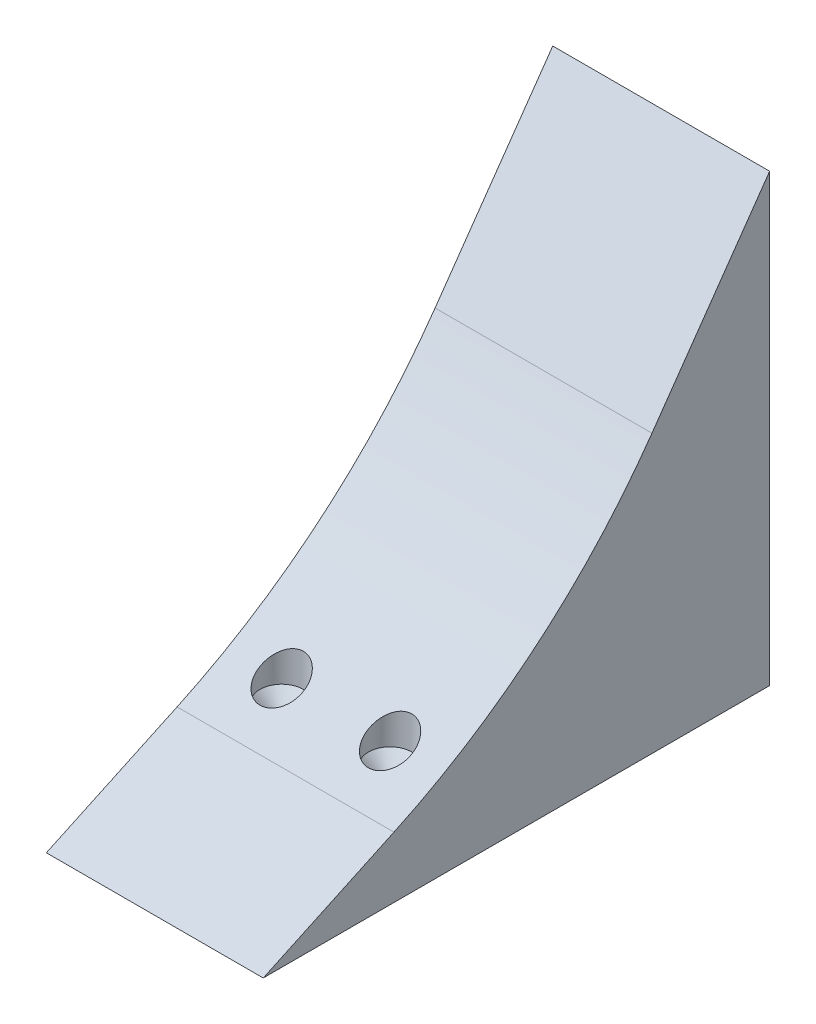
ISO-10303-21;
HEADER;
FILE_DESCRIPTION(('STEP AP214'),'2;1');
FILE_NAME('part.step','',(''),(''),'','','');
FILE_SCHEMA(('AUTOMOTIVE_DESIGN { 1 0 10303 214 1 1 1 1 }'));
ENDSEC;
DATA;
#1=APPLICATION_CONTEXT('core data for automotive mechanical design processes');
#2=APPLICATION_PROTOCOL_DEFINITION('international standard','automotive_design',2000,#1);
#3=PRODUCT_CONTEXT('',#1,'mechanical');
#4=PRODUCT('Part','Part','',(#3));
#5=PRODUCT_RELATED_PRODUCT_CATEGORY('part','',(#4));
#6=PRODUCT_DEFINITION_FORMATION('','',#4);
#7=PRODUCT_DEFINITION_CONTEXT('part definition',#1,'design');
#8=PRODUCT_DEFINITION('design','',#6,#7);
#9=PRODUCT_DEFINITION_SHAPE('','',#8);
#10=(LENGTH_UNIT() NAMED_UNIT(*) SI_UNIT(.MILLI.,.METRE.));
#11=(NAMED_UNIT(*) PLANE_ANGLE_UNIT() SI_UNIT($,.RADIAN.));
#12=(NAMED_UNIT(*) SI_UNIT($,.STERADIAN.) SOLID_ANGLE_UNIT());
#13=UNCERTAINTY_MEASURE_WITH_UNIT(LENGTH_MEASURE(1.E-05),#10,'distance_accuracy_value','');
#14=(GEOMETRIC_REPRESENTATION_CONTEXT(3) GLOBAL_UNCERTAINTY_ASSIGNED_CONTEXT((#13)) GLOBAL_UNIT_ASSIGNED_CONTEXT((#10,
#11,#12)) REPRESENTATION_CONTEXT('',''));
#15=CARTESIAN_POINT('',(0.,0.,0.));
#16=DIRECTION('',(0.,0.,1.));
#17=DIRECTION('',(1.,0.,0.));
#18=AXIS2_PLACEMENT_3D('',#15,#16,#17);
#19=CARTESIAN_POINT('',(50.8,28.0847994332052,95.2759098807705));
#20=DIRECTION('',(-1.,0.,0.));
#21=DIRECTION('',(0.,0.,1.));
#22=AXIS2_PLACEMENT_3D('',#19,#20,#21);
#23=CYLINDRICAL_SURFACE('',#22,152.4);
#24=CARTESIAN_POINT('',(12.7,-100.831148377762,13.9959098807705));
#25=CARTESIAN_POINT('',(12.827095889129,-100.831146925053,13.9959077338625));
#26=CARTESIAN_POINT('',(12.954168337019,-100.834158644722,14.0006838358532));
#27=CARTESIAN_POINT('',(13.2073590694925,-100.846155104622,14.0197156893053));
#28=CARTESIAN_POINT('',(13.3334771112958,-100.855141316184,14.0339737758832));
#29=CARTESIAN_POINT('',(13.583836827044,-100.878956948277,14.0717841490509));
#30=CARTESIAN_POINT('',(13.7080771234869,-100.893790461031,14.0953429447426));
#31=CARTESIAN_POINT('',(13.9537452936141,-100.929081379971,14.1514397468149));
#32=CARTESIAN_POINT('',(14.0751720152792,-100.94954104716,14.183981363177));
#33=CARTESIAN_POINT('',(14.3138567866955,-100.995694177725,14.25746728632));
#34=CARTESIAN_POINT('',(14.431130177653,-101.021365341579,14.2983757973141));
#35=CARTESIAN_POINT('',(14.6613661964323,-101.077653533963,14.3881879959891));
#36=CARTESIAN_POINT('',(14.7743271719837,-101.108272435132,14.4370947109454));
#37=CARTESIAN_POINT('',(15.1057171021053,-101.206978793559,14.5949859622279));
#38=CARTESIAN_POINT('',(15.3168808773068,-101.281960831124,14.7152129265991));
#39=CARTESIAN_POINT('',(15.7280461076282,-101.452118847568,14.9890848863961));
#40=CARTESIAN_POINT('',(15.9265732442734,-101.548249939235,15.14432490556));
#41=CARTESIAN_POINT('',(16.2949794432509,-101.753968029832,15.478084589699));
#42=CARTESIAN_POINT('',(16.4648463452128,-101.863560706527,15.6566140795798));
#43=CARTESIAN_POINT('',(16.7972552974629,-102.109801400589,16.0598164901569));
#44=CARTESIAN_POINT('',(16.9550534750942,-102.248058683302,16.287415042392));
#45=CARTESIAN_POINT('',(17.2300247530824,-102.533711225513,16.7606805266267));
#46=CARTESIAN_POINT('',(17.3471738840227,-102.681111816346,17.0063580160561));
#47=CARTESIAN_POINT('',(17.553604500292,-103.002199985407,17.545158059831));
#48=CARTESIAN_POINT('',(17.6367895530178,-103.17670334522,17.8401426625707));
#49=CARTESIAN_POINT('',(17.7491095191719,-103.52807821422,18.4388664160298));
#50=CARTESIAN_POINT('',(17.7782182043303,-103.704950830685,18.7426097424388));
#51=CARTESIAN_POINT('',(17.7817500527579,-104.070335474302,19.3751645021489));
#52=CARTESIAN_POINT('',(17.7518190194479,-104.25870270854,19.7041159179249));
#53=CARTESIAN_POINT('',(17.6587965782812,-104.535346963207,20.1913434883379));
#54=CARTESIAN_POINT('',(17.6197252867779,-104.626637140789,20.3528267474144));
#55=CARTESIAN_POINT('',(17.5254602980328,-104.806594348569,20.6724853068499));
#56=CARTESIAN_POINT('',(17.4702744096019,-104.895262626422,20.8306621697331));
#57=CARTESIAN_POINT('',(17.3449888107755,-105.067586834879,21.139328429104));
#58=CARTESIAN_POINT('',(17.2751965952473,-105.15130639171,21.289907190589));
#59=CARTESIAN_POINT('',(17.1202071069377,-105.314788478739,21.5850801784497));
#60=CARTESIAN_POINT('',(17.035017451534,-105.394552940836,21.729677320761));
#61=CARTESIAN_POINT('',(16.8494269040788,-105.549393350824,22.0114003504996));
#62=CARTESIAN_POINT('',(16.749029104856,-105.624470247636,22.1485277493315));
#63=CARTESIAN_POINT('',(16.5333784312333,-105.769151867417,22.4136938278648));
#64=CARTESIAN_POINT('',(16.4181277316201,-105.838757389117,22.5417338339095));
#65=CARTESIAN_POINT('',(16.1861977308859,-105.96470071235,22.7741366949434));
#66=CARTESIAN_POINT('',(16.0709345661399,-106.021664458877,22.87957457072));
#67=CARTESIAN_POINT('',(15.8295906201687,-106.129935819531,23.0804954625161));
#68=CARTESIAN_POINT('',(15.7035117424651,-106.181244425322,23.1759802237175));
#69=CARTESIAN_POINT('',(15.4414436089878,-106.277566746852,23.3556419242981));
#70=CARTESIAN_POINT('',(15.3054625785913,-106.322585598551,23.4398280874186));
#71=CARTESIAN_POINT('',(15.0245476747473,-106.405787411191,23.5957183080165));
#72=CARTESIAN_POINT('',(14.8796152363313,-106.443971464036,23.6674243592232));
#73=CARTESIAN_POINT('',(14.6020255813397,-106.508341667286,23.7884954641284));
#74=CARTESIAN_POINT('',(14.470323284551,-106.535449730123,23.8395663502029));
#75=CARTESIAN_POINT('',(14.2021600334595,-106.583823762432,23.930800751528));
#76=CARTESIAN_POINT('',(14.0656997623001,-106.605090566723,23.9709658254027));
#77=CARTESIAN_POINT('',(13.789194681394,-106.641516335707,24.0398139866264));
#78=CARTESIAN_POINT('',(13.6491518965172,-106.65667867298,24.068503413954));
#79=CARTESIAN_POINT('',(13.3666197076415,-106.680719699487,24.1140133385176));
#80=CARTESIAN_POINT('',(13.2241304692016,-106.689598812222,24.1308346356881));
#81=CARTESIAN_POINT('',(12.9517832283342,-106.700412191532,24.1513231133066));
#82=CARTESIAN_POINT('',(12.8220305883379,-106.702933028113,24.1561012735256));
#83=CARTESIAN_POINT('',(12.5624996487246,-106.702724851373,24.1557067107785));
#84=CARTESIAN_POINT('',(12.4327213540076,-106.699994174033,24.1505308337279));
#85=CARTESIAN_POINT('',(12.1742310494174,-106.689311550241,24.1302906315561));
#86=CARTESIAN_POINT('',(12.0455184768466,-106.681362564196,24.1152319130863));
#87=CARTESIAN_POINT('',(11.7899831888008,-106.660327697537,24.0754097397805));
#88=CARTESIAN_POINT('',(11.6631611949375,-106.647239905102,24.0506426730921));
#89=CARTESIAN_POINT('',(11.4152512561247,-106.616421918236,23.9923772382394));
#90=CARTESIAN_POINT('',(11.2940985312823,-106.598806076068,23.9590940218814));
#91=CARTESIAN_POINT('',(11.0552567389438,-106.558971301633,23.8839159013728));
#92=CARTESIAN_POINT('',(10.937568906134,-106.536750750657,23.8420179689005));
#93=CARTESIAN_POINT('',(10.5908674990325,-106.463481257388,23.7040504872464));
#94=CARTESIAN_POINT('',(10.3680007216941,-106.405797400563,23.5956558812597));
#95=CARTESIAN_POINT('',(9.93361549142082,-106.271562491855,23.3443509910213));
#96=CARTESIAN_POINT('',(9.72316698329659,-106.194233957897,23.200025085687));
#97=CARTESIAN_POINT('',(9.32963246907217,-106.024762347907,22.8851826802097));
#98=CARTESIAN_POINT('',(9.14655602835064,-105.932614116259,22.7146570663916));
#99=CARTESIAN_POINT('',(8.7935608707029,-105.726240562584,22.3347233176461));
#100=CARTESIAN_POINT('',(8.62674273471279,-105.610732472161,22.1231367592106));
#101=CARTESIAN_POINT('',(8.33083240723465,-105.367978027089,21.6812101002625));
#102=CARTESIAN_POINT('',(8.20175755568558,-105.240726312418,21.4508614420443));
#103=CARTESIAN_POINT('',(7.968659404381,-104.961374984458,20.9484747320168));
#104=CARTESIAN_POINT('',(7.86958715598827,-104.808135072699,20.6747723526757));
#105=CARTESIAN_POINT('',(7.7197888419949,-104.494329803347,20.1184971604444));
#106=CARTESIAN_POINT('',(7.66908645801351,-104.33376089779,19.8359200724041));
#107=CARTESIAN_POINT('',(7.612795382673,-103.991397013284,19.2379646288701));
#108=CARTESIAN_POINT('',(7.61261846318018,-103.809170164582,18.9223137988873));
#109=CARTESIAN_POINT('',(7.67033134742373,-103.44477642041,18.296288093648));
#110=CARTESIAN_POINT('',(7.72824597607306,-103.262609583877,17.9859155316789));
#111=CARTESIAN_POINT('',(7.90574266968815,-102.894687698444,17.3639719327081));
#112=CARTESIAN_POINT('',(8.02809402845026,-102.709166135186,17.0530296121079));
#113=CARTESIAN_POINT('',(8.25806126787879,-102.44001769135,16.6053126686959));
#114=CARTESIAN_POINT('',(8.34254046403777,-102.351759093106,16.4590838527898));
#115=CARTESIAN_POINT('',(8.52684415146758,-102.17919264564,16.1742033854583));
#116=CARTESIAN_POINT('',(8.62665983398497,-102.094882564568,16.0355474460092));
#117=CARTESIAN_POINT('',(8.83579552403475,-101.935470541522,15.7742644671224));
#118=CARTESIAN_POINT('',(8.94435179844161,-101.860117759509,15.6511788824258));
#119=CARTESIAN_POINT('',(9.17461595651684,-101.714847119835,15.4145863020849));
#120=CARTESIAN_POINT('',(9.29631588032092,-101.644926016347,15.3010735824261));
#121=CARTESIAN_POINT('',(9.55221322646977,-101.511592789354,15.0851921628838));
#122=CARTESIAN_POINT('',(9.68639449091747,-101.44817246784,14.9828094170838));
#123=CARTESIAN_POINT('',(9.96657006383133,-101.328852173077,14.7906343912239));
#124=CARTESIAN_POINT('',(10.1125592330218,-101.272948955992,14.7008366796625));
#125=CARTESIAN_POINT('',(10.3724696871111,-101.184346841174,14.5587944660248));
#126=CARTESIAN_POINT('',(10.4838110467079,-101.149552198523,14.5031045325393));
#127=CARTESIAN_POINT('',(10.7114509556421,-101.084815110437,14.3996191447956));
#128=CARTESIAN_POINT('',(10.827748376918,-101.054871568202,14.3518219060088));
#129=CARTESIAN_POINT('',(11.0644833422491,-101.000261020421,14.2647389841772));
#130=CARTESIAN_POINT('',(11.1849142053123,-100.975585926156,14.2254402520517));
#131=CARTESIAN_POINT('',(11.4292828592441,-100.93180350236,14.155765301408));
#132=CARTESIAN_POINT('',(11.5532198539525,-100.912694919765,14.1253870748016));
#133=CARTESIAN_POINT('',(11.8455083190916,-100.874937058407,14.0653931109467));
#134=CARTESIAN_POINT('',(12.0149161589382,-100.858556338521,14.0393946061975));
#135=CARTESIAN_POINT('',(12.356229994743,-100.836662015205,14.0046529100892));
#136=CARTESIAN_POINT('',(12.5281364290025,-100.831150342167,13.9959127838957));
#137=CARTESIAN_POINT('',(12.7,-100.831148377762,13.9959098807705));
#138=B_SPLINE_CURVE_WITH_KNOTS('',3,(#24,#25,#26,#27,#28,#29,#30,#31,#32,#33,#34,#35,#36,#37,
#38,#39,#40,#41,#42,#43,#44,#45,#46,#47,#48,#49,#50,#51,#52,#53,#54,#55,#56,#57,#58,#59,#60,#61,
#62,#63,#64,#65,#66,#67,#68,#69,#70,#71,#72,#73,#74,#75,#76,#77,#78,#79,#80,#81,#82,#83,#84,#85,
#86,#87,#88,#89,#90,#91,#92,#93,#94,#95,#96,#97,#98,#99,#100,#101,#102,#103,#104,#105,#106,#107,
#108,#109,#110,#111,#112,#113,#114,#115,#116,#117,#118,#119,#120,#121,#122,#123,#124,#125,#126,
#127,#128,#129,#130,#131,#132,#133,#134,#135,#136,#137),.UNSPECIFIED.,.T.,.F.,(4,2,2,2,2,2,2,2,
2,2,2,2,2,2,2,2,2,2,2,2,2,2,2,2,2,2,2,2,2,2,2,2,2,2,2,2,2,2,2,2,2,2,2,2,2,2,2,2,2,2,2,2,2,2,2,2,
4),(0.,0.381122593250434,0.762339079856872,1.14382283515142,1.52546012342961,1.90549759438694,
2.28567924172156,3.0453222108482,3.85146114313089,4.65794125997345,5.58292416915991,
6.50845158736422,7.56200460978079,8.61606849613382,9.75077544998317,10.3188994645731,
10.8867486332169,11.4436682393201,12.0003130781339,12.5568448655749,13.1132952570846,
13.6114162539816,14.1094497627562,14.6070741903823,15.1046190481407,15.5355417520118,
15.9664028373151,16.3970255538611,16.8276192428423,17.2167366037731,17.605977282631,
17.9949973313668,18.384162247033,18.7643278862046,19.1446273937659,19.9045652911706,
20.7012520214109,21.4982165124507,22.3741390922667,23.2504634565845,24.2332900054288,
25.2165974941665,26.3051911842383,27.3942502735422,28.53447301402,29.1054689836457,
29.6761382102972,30.217143927625,30.7578238269598,31.2978132724979,31.8375689446992,
32.2249694724501,32.6122822891201,32.9989961137966,33.3856228187686,33.9008988055478,
34.4162662994357),.UNSPECIFIED.);
#139=CARTESIAN_POINT('',(12.7,-100.831148377762,13.9959098807705));
#140=VERTEX_POINT('',#139);
#141=EDGE_CURVE('E163',#140,#140,#138,.T.);
#142=ORIENTED_EDGE('',*,*,#141,.T.);
#143=EDGE_LOOP('',(#142));
#144=FACE_BOUND('',#143,.T.);
#145=CARTESIAN_POINT('',(38.1,-100.831148377762,13.9959098807705));
#146=CARTESIAN_POINT('',(38.227095889129,-100.831146925053,13.9959077338625));
#147=CARTESIAN_POINT('',(38.354168337019,-100.834158644722,14.0006838358532));
#148=CARTESIAN_POINT('',(38.6073590694925,-100.846155104622,14.0197156893053));
#149=CARTESIAN_POINT('',(38.7334771112958,-100.855141316184,14.0339737758832));
#150=CARTESIAN_POINT('',(38.983836827044,-100.878956948277,14.0717841490509));
#151=CARTESIAN_POINT('',(39.1080771234869,-100.893790461031,14.0953429447426));
#152=CARTESIAN_POINT('',(39.3537452936141,-100.929081379971,14.1514397468149));
#153=CARTESIAN_POINT('',(39.4751720152792,-100.949541047161,14.1839813631769));
#154=CARTESIAN_POINT('',(39.7138567866955,-100.995694177725,14.25746728632));
#155=CARTESIAN_POINT('',(39.831130177653,-101.021365341579,14.2983757973141));
#156=CARTESIAN_POINT('',(40.0613661964323,-101.077653533963,14.3881879959891));
#157=CARTESIAN_POINT('',(40.1743271719837,-101.108272435132,14.4370947109454));
#158=CARTESIAN_POINT('',(40.5057171021053,-101.20697879356,14.5949859622279));
#159=CARTESIAN_POINT('',(40.7168808773068,-101.281960831124,14.715212926599));
#160=CARTESIAN_POINT('',(41.1280461076282,-101.452118847568,14.9890848863961));
#161=CARTESIAN_POINT('',(41.3265732442734,-101.548249939235,15.14432490556));
#162=CARTESIAN_POINT('',(41.694979443251,-101.753968029832,15.478084589699));
#163=CARTESIAN_POINT('',(41.8648463452128,-101.863560706527,15.6566140795798));
#164=CARTESIAN_POINT('',(42.1972552974629,-102.109801400589,16.0598164901569));
#165=CARTESIAN_POINT('',(42.3550534750942,-102.248058683302,16.287415042392));
#166=CARTESIAN_POINT('',(42.6300247530824,-102.533711225513,16.7606805266267));
#167=CARTESIAN_POINT('',(42.7471738840227,-102.681111816346,17.0063580160561));
#168=CARTESIAN_POINT('',(42.9536045002921,-103.002199985407,17.545158059831));
#169=CARTESIAN_POINT('',(43.0367895530178,-103.17670334522,17.8401426625707));
#170=CARTESIAN_POINT('',(43.1491095191719,-103.52807821422,18.4388664160298));
#171=CARTESIAN_POINT('',(43.1782182043303,-103.704950830685,18.7426097424388));
#172=CARTESIAN_POINT('',(43.1817500527579,-104.070335474302,19.375164502149));
#173=CARTESIAN_POINT('',(43.1518190194479,-104.25870270854,19.704115917925));
#174=CARTESIAN_POINT('',(43.0587965782812,-104.535346963207,20.1913434883379));
#175=CARTESIAN_POINT('',(43.0197252867779,-104.626637140789,20.3528267474144));
#176=CARTESIAN_POINT('',(42.9254602980329,-104.806594348569,20.6724853068499));
#177=CARTESIAN_POINT('',(42.8702744096019,-104.895262626422,20.8306621697331));
#178=CARTESIAN_POINT('',(42.7449888107755,-105.067586834879,21.139328429104));
#179=CARTESIAN_POINT('',(42.6751965952473,-105.15130639171,21.289907190589));
#180=CARTESIAN_POINT('',(42.5202071069377,-105.314788478739,21.5850801784497));
#181=CARTESIAN_POINT('',(42.435017451534,-105.394552940836,21.7296773207611));
#182=CARTESIAN_POINT('',(42.2494269040788,-105.549393350824,22.0114003504996));
#183=CARTESIAN_POINT('',(42.149029104856,-105.624470247636,22.1485277493315));
#184=CARTESIAN_POINT('',(41.9333784312333,-105.769151867417,22.4136938278648));
#185=CARTESIAN_POINT('',(41.8181277316201,-105.838757389117,22.5417338339095));
#186=CARTESIAN_POINT('',(41.5861977308859,-105.96470071235,22.7741366949434));
#187=CARTESIAN_POINT('',(41.4709345661399,-106.021664458877,22.87957457072));
#188=CARTESIAN_POINT('',(41.2295906201687,-106.129935819531,23.0804954625161));
#189=CARTESIAN_POINT('',(41.1035117424651,-106.181244425322,23.1759802237175));
#190=CARTESIAN_POINT('',(40.8414436089878,-106.277566746852,23.3556419242981));
#191=CARTESIAN_POINT('',(40.7054625785913,-106.322585598551,23.4398280874186));
#192=CARTESIAN_POINT('',(40.4245476747473,-106.405787411191,23.5957183080165));
#193=CARTESIAN_POINT('',(40.2796152363313,-106.443971464036,23.6674243592232));
#194=CARTESIAN_POINT('',(40.0020255813397,-106.508341667286,23.7884954641284));
#195=CARTESIAN_POINT('',(39.870323284551,-106.535449730123,23.8395663502029));
#196=CARTESIAN_POINT('',(39.6021600334595,-106.583823762432,23.930800751528));
#197=CARTESIAN_POINT('',(39.4656997623001,-106.605090566723,23.9709658254027));
#198=CARTESIAN_POINT('',(39.189194681394,-106.641516335707,24.0398139866264));
#199=CARTESIAN_POINT('',(39.0491518965172,-106.65667867298,24.068503413954));
#200=CARTESIAN_POINT('',(38.7666197076415,-106.680719699487,24.1140133385176));
#201=CARTESIAN_POINT('',(38.6241304692015,-106.689598812222,24.1308346356881));
#202=CARTESIAN_POINT('',(38.3517832283342,-106.700412191532,24.1513231133066));
#203=CARTESIAN_POINT('',(38.2220305883379,-106.702933028113,24.1561012735256));
#204=CARTESIAN_POINT('',(37.9624996487246,-106.702724851373,24.1557067107785));
#205=CARTESIAN_POINT('',(37.8327213540076,-106.699994174033,24.1505308337279));
#206=CARTESIAN_POINT('',(37.5742310494174,-106.689311550241,24.1302906315561));
#207=CARTESIAN_POINT('',(37.4455184768466,-106.681362564196,24.1152319130863));
#208=CARTESIAN_POINT('',(37.1899831888008,-106.660327697537,24.0754097397805));
#209=CARTESIAN_POINT('',(37.0631611949374,-106.647239905102,24.0506426730921));
#210=CARTESIAN_POINT('',(36.8152512561247,-106.616421918236,23.9923772382394));
#211=CARTESIAN_POINT('',(36.6940985312823,-106.598806076068,23.9590940218814));
#212=CARTESIAN_POINT('',(36.4552567389438,-106.558971301633,23.8839159013728));
#213=CARTESIAN_POINT('',(36.337568906134,-106.536750750657,23.8420179689005));
#214=CARTESIAN_POINT('',(35.9908674990325,-106.463481257388,23.7040504872464));
#215=CARTESIAN_POINT('',(35.7680007216941,-106.405797400563,23.5956558812597));
#216=CARTESIAN_POINT('',(35.3336154914208,-106.271562491855,23.3443509910213));
#217=CARTESIAN_POINT('',(35.1231669832966,-106.194233957897,23.200025085687));
#218=CARTESIAN_POINT('',(34.7296324690722,-106.024762347907,22.8851826802097));
#219=CARTESIAN_POINT('',(34.5465560283506,-105.932614116259,22.7146570663916));
#220=CARTESIAN_POINT('',(34.1935608707029,-105.726240562584,22.3347233176461));
#221=CARTESIAN_POINT('',(34.0267427347128,-105.610732472161,22.1231367592106));
#222=CARTESIAN_POINT('',(33.7308324072346,-105.367978027089,21.6812101002625));
#223=CARTESIAN_POINT('',(33.6017575556856,-105.240726312418,21.4508614420443));
#224=CARTESIAN_POINT('',(33.368659404381,-104.961374984458,20.9484747320168));
#225=CARTESIAN_POINT('',(33.2695871559883,-104.808135072699,20.6747723526757));
#226=CARTESIAN_POINT('',(33.1197888419949,-104.494329803347,20.1184971604444));
#227=CARTESIAN_POINT('',(33.0690864580135,-104.33376089779,19.8359200724041));
#228=CARTESIAN_POINT('',(33.012795382673,-103.991397013284,19.2379646288701));
#229=CARTESIAN_POINT('',(33.0126184631802,-103.809170164582,18.9223137988873));
#230=CARTESIAN_POINT('',(33.0703313474237,-103.44477642041,18.296288093648));
#231=CARTESIAN_POINT('',(33.128245976073,-103.262609583877,17.9859155316789));
#232=CARTESIAN_POINT('',(33.3057426696881,-102.894687698444,17.3639719327081));
#233=CARTESIAN_POINT('',(33.4280940284502,-102.709166135186,17.053029612108));
#234=CARTESIAN_POINT('',(33.6580612678788,-102.44001769135,16.6053126686959));
#235=CARTESIAN_POINT('',(33.7425404640378,-102.351759093106,16.4590838527898));
#236=CARTESIAN_POINT('',(33.9268441514676,-102.17919264564,16.1742033854583));
#237=CARTESIAN_POINT('',(34.026659833985,-102.094882564568,16.0355474460092));
#238=CARTESIAN_POINT('',(34.2357955240347,-101.935470541522,15.7742644671224));
#239=CARTESIAN_POINT('',(34.3443517984416,-101.860117759509,15.6511788824258));
#240=CARTESIAN_POINT('',(34.5746159565168,-101.714847119835,15.4145863020849));
#241=CARTESIAN_POINT('',(34.6963158803209,-101.644926016347,15.3010735824261));
#242=CARTESIAN_POINT('',(34.9522132264698,-101.511592789354,15.0851921628838));
#243=CARTESIAN_POINT('',(35.0863944909175,-101.44817246784,14.9828094170838));
#244=CARTESIAN_POINT('',(35.3665700638313,-101.328852173077,14.7906343912239));
#245=CARTESIAN_POINT('',(35.5125592330218,-101.272948955992,14.7008366796625));
#246=CARTESIAN_POINT('',(35.7724696871111,-101.184346841174,14.5587944660248));
#247=CARTESIAN_POINT('',(35.8838110467079,-101.149552198523,14.5031045325393));
#248=CARTESIAN_POINT('',(36.1114509556421,-101.084815110437,14.3996191447956));
#249=CARTESIAN_POINT('',(36.227748376918,-101.054871568202,14.3518219060088));
#250=CARTESIAN_POINT('',(36.4644833422491,-101.000261020421,14.2647389841772));
#251=CARTESIAN_POINT('',(36.5849142053123,-100.975585926156,14.2254402520517));
#252=CARTESIAN_POINT('',(36.8292828592441,-100.93180350236,14.155765301408));
#253=CARTESIAN_POINT('',(36.9532198539525,-100.912694919765,14.1253870748016));
#254=CARTESIAN_POINT('',(37.2455083190916,-100.874937058407,14.0653931109467));
#255=CARTESIAN_POINT('',(37.4149161589382,-100.858556338521,14.0393946061975));
#256=CARTESIAN_POINT('',(37.756229994743,-100.836662015205,14.0046529100892));
#257=CARTESIAN_POINT('',(37.9281364290025,-100.831150342167,13.9959127838957));
#258=CARTESIAN_POINT('',(38.1,-100.831148377762,13.9959098807705));
#259=B_SPLINE_CURVE_WITH_KNOTS('',3,(#145,#146,#147,#148,#149,#150,#151,#152,#153,#154,#155,
#156,#157,#158,#159,#160,#161,#162,#163,#164,#165,#166,#167,#168,#169,#170,#171,#172,#173,#174,
#175,#176,#177,#178,#179,#180,#181,#182,#183,#184,#185,#186,#187,#188,#189,#190,#191,#192,#193,
#194,#195,#196,#197,#198,#199,#200,#201,#202,#203,#204,#205,#206,#207,#208,#209,#210,#211,#212,
#213,#214,#215,#216,#217,#218,#219,#220,#221,#222,#223,#224,#225,#226,#227,#228,#229,#230,#231,
#232,#233,#234,#235,#236,#237,#238,#239,#240,#241,#242,#243,#244,#245,#246,#247,#248,#249,#250,
#251,#252,#253,#254,#255,#256,#257,#258),.UNSPECIFIED.,.T.,.F.,(4,2,2,2,2,2,2,2,2,2,2,2,2,2,2,2,
2,2,2,2,2,2,2,2,2,2,2,2,2,2,2,2,2,2,2,2,2,2,2,2,2,2,2,2,2,2,2,2,2,2,2,2,2,2,2,2,4),(0.,
0.381122593250446,0.762339079856881,1.14382283515144,1.52546012342961,1.90549759438694,
2.28567924172157,3.04532221084821,3.8514611431309,4.65794125997346,5.58292416915991,
6.50845158736422,7.56200460978079,8.61606849613383,9.75077544998318,10.3188994645731,
10.886748633217,11.4436682393201,12.0003130781339,12.5568448655749,13.1132952570846,
13.6114162539816,14.1094497627562,14.6070741903823,15.1046190481408,15.5355417520118,
15.9664028373151,16.3970255538611,16.8276192428423,17.2167366037732,17.605977282631,
17.9949973313668,18.384162247033,18.7643278862046,19.144627393766,19.9045652911706,
20.701252021411,21.4982165124507,22.3741390922668,23.2504634565845,24.2332900054288,
25.2165974941665,26.3051911842383,27.3942502735423,28.5344730140201,29.1054689836457,
29.6761382102972,30.217143927625,30.7578238269598,31.297813272498,31.8375689446993,
32.2249694724501,32.6122822891201,32.9989961137967,33.3856228187686,33.9008988055478,
34.4162662994357),.UNSPECIFIED.);
#260=CARTESIAN_POINT('',(38.1,-100.831148377762,13.9959098807705));
#261=VERTEX_POINT('',#260);
#262=EDGE_CURVE('E154',#261,#261,#259,.T.);
#263=ORIENTED_EDGE('',*,*,#262,.T.);
#264=EDGE_LOOP('',(#263));
#265=FACE_BOUND('',#264,.T.);
#266=CARTESIAN_POINT('',(0.,28.0847994332052,95.2759098807705));
#267=DIRECTION('',(-1.,0.,0.));
#268=DIRECTION('',(0.,0.,-1.));
#269=AXIS2_PLACEMENT_3D('',#266,#267,#268);
#270=CIRCLE('',#269,152.4);
#271=CARTESIAN_POINT('',(0.,-59.3282494666939,-29.5628616688721));
#272=VERTEX_POINT('',#271);
#273=CARTESIAN_POINT('',(0.,-110.036507311181,30.8688867914888));
#274=VERTEX_POINT('',#273);
#275=EDGE_CURVE('E121',#272,#274,#270,.T.);
#276=ORIENTED_EDGE('',*,*,#275,.T.);
#277=DIRECTION('',(-1.,0.,0.));
#278=VECTOR('',#277,1.);
#279=CARTESIAN_POINT('',(50.8,-110.036507311181,30.8688867914888));
#280=LINE('',#279,#278);
#281=CARTESIAN_POINT('',(50.8,-110.036507311181,30.8688867914888));
#282=VERTEX_POINT('',#281);
#283=EDGE_CURVE('E142',#282,#274,#280,.T.);
#284=ORIENTED_EDGE('',*,*,#283,.F.);
#285=CARTESIAN_POINT('',(50.8,28.0847994332052,95.2759098807705));
#286=DIRECTION('',(-1.,0.,0.));
#287=DIRECTION('',(0.,0.,-1.));
#288=AXIS2_PLACEMENT_3D('',#285,#286,#287);
#289=CIRCLE('',#288,152.4);
#290=CARTESIAN_POINT('',(50.8,-59.3282494666939,-29.5628616688721));
#291=VERTEX_POINT('',#290);
#292=EDGE_CURVE('E135',#291,#282,#289,.T.);
#293=ORIENTED_EDGE('',*,*,#292,.F.);
#294=DIRECTION('',(-1.,0.,0.));
#295=VECTOR('',#294,1.);
#296=CARTESIAN_POINT('',(50.8,-59.3282494666939,-29.5628616688721));
#297=LINE('',#296,#295);
#298=EDGE_CURVE('E117',#291,#272,#297,.T.);
#299=ORIENTED_EDGE('',*,*,#298,.T.);
#300=EDGE_LOOP('',(#276,#284,#293,#299));
#301=FACE_BOUND('',#300,.T.);
#302=ADVANCED_FACE('F39',(#144,#265,#301),#23,.F.);
#303=CARTESIAN_POINT('',(50.8,-110.036507311181,30.8688867914888));
#304=DIRECTION('',(0.,-0.906307787036653,-0.422618261740694));
#305=DIRECTION('',(0.,0.422618261740694,-0.906307787036653));
#306=AXIS2_PLACEMENT_3D('',#303,#304,#305);
#307=PLANE('',#306);
#308=DIRECTION('',(0.,-0.422618261740694,0.906307787036653));
#309=VECTOR('',#308,1.);
#310=CARTESIAN_POINT('',(0.,-110.036507311181,30.8688867914888));
#311=LINE('',#310,#309);
#312=CARTESIAN_POINT('',(0.,-124.315200566795,61.489643293987));
#313=VERTEX_POINT('',#312);
#314=EDGE_CURVE('E125',#274,#313,#311,.T.);
#315=ORIENTED_EDGE('',*,*,#314,.T.);
#316=DIRECTION('',(-1.,0.,0.));
#317=VECTOR('',#316,1.);
#318=CARTESIAN_POINT('',(50.8,-124.315200566795,61.489643293987));
#319=LINE('',#318,#317);
#320=CARTESIAN_POINT('',(50.8,-124.315200566795,61.489643293987));
#321=VERTEX_POINT('',#320);
#322=EDGE_CURVE('E110',#321,#313,#319,.T.);
#323=ORIENTED_EDGE('',*,*,#322,.F.);
#324=DIRECTION('',(0.,-0.422618261740694,0.906307787036653));
#325=VECTOR('',#324,1.);
#326=CARTESIAN_POINT('',(50.8,-110.036507311181,30.8688867914888));
#327=LINE('',#326,#325);
#328=EDGE_CURVE('E92',#282,#321,#327,.T.);
#329=ORIENTED_EDGE('',*,*,#328,.F.);
#330=ORIENTED_EDGE('',*,*,#283,.T.);
#331=EDGE_LOOP('',(#315,#323,#329,#330));
#332=FACE_BOUND('',#331,.T.);
#333=ADVANCED_FACE('F200',(#332),#307,.F.);
#334=CARTESIAN_POINT('',(50.8,-124.315200566795,61.489643293987));
#335=DIRECTION('',(0.,1.,0.));
#336=DIRECTION('',(0.,0.,1.));
#337=AXIS2_PLACEMENT_3D('',#334,#335,#336);
#338=PLANE('',#337);
#339=CARTESIAN_POINT('',(12.7,-124.315200566795,19.0759098807705));
#340=DIRECTION('',(0.,-1.,0.));
#341=DIRECTION('',(0.,0.,-1.));
#342=AXIS2_PLACEMENT_3D('',#339,#340,#341);
#343=CIRCLE('',#342,1.905);
#344=CARTESIAN_POINT('',(12.7,-124.315200566795,17.1709098807705));
#345=VERTEX_POINT('',#344);
#346=EDGE_CURVE('E126',#345,#345,#343,.T.);
#347=ORIENTED_EDGE('',*,*,#346,.F.);
#348=EDGE_LOOP('',(#347));
#349=FACE_BOUND('',#348,.T.);
#350=CARTESIAN_POINT('',(38.1,-124.315200566795,19.0759098807705));
#351=DIRECTION('',(0.,-1.,0.));
#352=DIRECTION('',(0.,0.,-1.));
#353=AXIS2_PLACEMENT_3D('',#350,#351,#352);
#354=CIRCLE('',#353,1.90500000000001);
#355=CARTESIAN_POINT('',(38.1,-124.315200566795,17.1709098807705));
#356=VERTEX_POINT('',#355);
#357=EDGE_CURVE('E215',#356,#356,#354,.T.);
#358=ORIENTED_EDGE('',*,*,#357,.F.);
#359=EDGE_LOOP('',(#358));
#360=FACE_BOUND('',#359,.T.);
#361=DIRECTION('',(0.,0.,-1.));
#362=VECTOR('',#361,1.);
#363=CARTESIAN_POINT('',(0.,-124.315200566795,61.489643293987));
#364=LINE('',#363,#362);
#365=CARTESIAN_POINT('',(0.,-124.315200566795,-57.1240901192295));
#366=VERTEX_POINT('',#365);
#367=EDGE_CURVE('E108',#313,#366,#364,.T.);
#368=ORIENTED_EDGE('',*,*,#367,.T.);
#369=DIRECTION('',(-1.,0.,0.));
#370=VECTOR('',#369,1.);
#371=CARTESIAN_POINT('',(50.8,-124.315200566795,-57.1240901192295));
#372=LINE('',#371,#370);
#373=CARTESIAN_POINT('',(50.8,-124.315200566795,-57.1240901192295));
#374=VERTEX_POINT('',#373);
#375=EDGE_CURVE('E105',#374,#366,#372,.T.);
#376=ORIENTED_EDGE('',*,*,#375,.F.);
#377=DIRECTION('',(0.,0.,-1.));
#378=VECTOR('',#377,1.);
#379=CARTESIAN_POINT('',(50.8,-124.315200566795,61.489643293987));
#380=LINE('',#379,#378);
#381=EDGE_CURVE('E96',#321,#374,#380,.T.);
#382=ORIENTED_EDGE('',*,*,#381,.F.);
#383=ORIENTED_EDGE('',*,*,#322,.T.);
#384=EDGE_LOOP('',(#368,#376,#382,#383));
#385=FACE_BOUND('',#384,.T.);
#386=ADVANCED_FACE('F106',(#349,#360,#385),#338,.F.);
#387=CARTESIAN_POINT('',(50.8,-124.315200566795,-57.1240901192295));
#388=DIRECTION('',(0.,0.,1.));
#389=DIRECTION('',(0.,-1.,0.));
#390=AXIS2_PLACEMENT_3D('',#387,#388,#389);
#391=PLANE('',#390);
#392=DIRECTION('',(0.,1.,0.));
#393=VECTOR('',#392,1.);
#394=CARTESIAN_POINT('',(0.,-124.315200566795,-57.1240901192295));
#395=LINE('',#394,#393);
#396=CARTESIAN_POINT('',(0.,-19.9667359919517,-57.1240901192295));
#397=VERTEX_POINT('',#396);
#398=EDGE_CURVE('E77',#366,#397,#395,.T.);
#399=ORIENTED_EDGE('',*,*,#398,.T.);
#400=DIRECTION('',(-1.,0.,0.));
#401=VECTOR('',#400,1.);
#402=CARTESIAN_POINT('',(50.8,-19.9667359919517,-57.1240901192295));
#403=LINE('',#402,#401);
#404=CARTESIAN_POINT('',(50.8,-19.9667359919517,-57.1240901192295));
#405=VERTEX_POINT('',#404);
#406=EDGE_CURVE('E111',#405,#397,#403,.T.);
#407=ORIENTED_EDGE('',*,*,#406,.F.);
#408=DIRECTION('',(0.,1.,0.));
#409=VECTOR('',#408,1.);
#410=CARTESIAN_POINT('',(50.8,-124.315200566795,-57.1240901192295));
#411=LINE('',#410,#409);
#412=EDGE_CURVE('E100',#374,#405,#411,.T.);
#413=ORIENTED_EDGE('',*,*,#412,.F.);
#414=ORIENTED_EDGE('',*,*,#375,.T.);
#415=EDGE_LOOP('',(#399,#407,#413,#414));
#416=FACE_BOUND('',#415,.T.);
#417=ADVANCED_FACE('F113',(#416),#391,.F.);
#418=CARTESIAN_POINT('',(50.8,-59.3282494666939,-29.5628616688721));
#419=DIRECTION('',(0.,-0.573576436351044,-0.819152044288993));
#420=DIRECTION('',(0.,0.819152044288993,-0.573576436351044));
#421=AXIS2_PLACEMENT_3D('',#418,#419,#420);
#422=PLANE('',#421);
#423=DIRECTION('',(0.,-0.819152044288993,0.573576436351044));
#424=VECTOR('',#423,1.);
#425=CARTESIAN_POINT('',(0.,-59.3282494666939,-29.5628616688721));
#426=LINE('',#425,#424);
#427=EDGE_CURVE('E83',#397,#272,#426,.T.);
#428=ORIENTED_EDGE('',*,*,#427,.T.);
#429=ORIENTED_EDGE('',*,*,#298,.F.);
#430=DIRECTION('',(0.,-0.819152044288993,0.573576436351044));
#431=VECTOR('',#430,1.);
#432=CARTESIAN_POINT('',(50.8,-59.3282494666939,-29.5628616688721));
#433=LINE('',#432,#431);
#434=EDGE_CURVE('E57',#405,#291,#433,.T.);
#435=ORIENTED_EDGE('',*,*,#434,.F.);
#436=ORIENTED_EDGE('',*,*,#406,.T.);
#437=EDGE_LOOP('',(#428,#429,#435,#436));
#438=FACE_BOUND('',#437,.T.);
#439=ADVANCED_FACE('F191',(#438),#422,.F.);
#440=CARTESIAN_POINT('',(50.8,28.0847994332052,95.2759098807705));
#441=DIRECTION('',(1.,0.,0.));
#442=DIRECTION('',(0.,0.,-1.));
#443=AXIS2_PLACEMENT_3D('',#440,#441,#442);
#444=PLANE('',#443);
#445=ORIENTED_EDGE('',*,*,#292,.T.);
#446=ORIENTED_EDGE('',*,*,#328,.T.);
#447=ORIENTED_EDGE('',*,*,#381,.T.);
#448=ORIENTED_EDGE('',*,*,#412,.T.);
#449=ORIENTED_EDGE('',*,*,#434,.T.);
#450=EDGE_LOOP('',(#445,#446,#447,#448,#449));
#451=FACE_BOUND('',#450,.T.);
#452=ADVANCED_FACE('F98',(#451),#444,.T.);
#453=CARTESIAN_POINT('',(0.,28.0847994332052,95.2759098807705));
#454=DIRECTION('',(1.,0.,0.));
#455=DIRECTION('',(0.,0.,-1.));
#456=AXIS2_PLACEMENT_3D('',#453,#454,#455);
#457=PLANE('',#456);
#458=ORIENTED_EDGE('',*,*,#275,.F.);
#459=ORIENTED_EDGE('',*,*,#427,.F.);
#460=ORIENTED_EDGE('',*,*,#398,.F.);
#461=ORIENTED_EDGE('',*,*,#367,.F.);
#462=ORIENTED_EDGE('',*,*,#314,.F.);
#463=EDGE_LOOP('',(#458,#459,#460,#461,#462));
#464=FACE_BOUND('',#463,.T.);
#465=ADVANCED_FACE('F187',(#464),#457,.F.);
#466=CARTESIAN_POINT('',(38.1,-22.7152005667948,19.0759098807705));
#467=DIRECTION('',(0.,-1.,0.));
#468=DIRECTION('',(0.,0.,-1.));
#469=AXIS2_PLACEMENT_3D('',#466,#467,#468);
#470=CYLINDRICAL_SURFACE('',#469,1.90500000000001);
#471=CARTESIAN_POINT('',(38.1,-111.615200566795,19.0759098807705));
#472=DIRECTION('',(0.,-1.,0.));
#473=DIRECTION('',(0.,0.,-1.));
#474=AXIS2_PLACEMENT_3D('',#471,#472,#473);
#475=CIRCLE('',#474,1.90500000000001);
#476=CARTESIAN_POINT('',(38.1,-111.615200566795,17.1709098807705));
#477=VERTEX_POINT('',#476);
#478=EDGE_CURVE('E150',#477,#477,#475,.F.);
#479=ORIENTED_EDGE('',*,*,#478,.T.);
#480=EDGE_LOOP('',(#479));
#481=FACE_BOUND('',#480,.T.);
#482=ORIENTED_EDGE('',*,*,#357,.T.);
#483=EDGE_LOOP('',(#482));
#484=FACE_BOUND('',#483,.T.);
#485=ADVANCED_FACE('F183',(#481,#484),#470,.F.);
#486=CARTESIAN_POINT('',(12.7,-22.7152005667948,19.0759098807705));
#487=DIRECTION('',(0.,-1.,0.));
#488=DIRECTION('',(0.,0.,-1.));
#489=AXIS2_PLACEMENT_3D('',#486,#487,#488);
#490=CYLINDRICAL_SURFACE('',#489,1.905);
#491=CARTESIAN_POINT('',(12.7,-111.615200566795,19.0759098807705));
#492=DIRECTION('',(0.,-1.,0.));
#493=DIRECTION('',(0.,0.,-1.));
#494=AXIS2_PLACEMENT_3D('',#491,#492,#493);
#495=CIRCLE('',#494,1.905);
#496=CARTESIAN_POINT('',(12.7,-111.615200566795,17.1709098807705));
#497=VERTEX_POINT('',#496);
#498=EDGE_CURVE('E146',#497,#497,#495,.F.);
#499=ORIENTED_EDGE('',*,*,#498,.T.);
#500=EDGE_LOOP('',(#499));
#501=FACE_BOUND('',#500,.T.);
#502=ORIENTED_EDGE('',*,*,#346,.T.);
#503=EDGE_LOOP('',(#502));
#504=FACE_BOUND('',#503,.T.);
#505=ADVANCED_FACE('F179',(#501,#504),#490,.F.);
#506=CARTESIAN_POINT('',(12.7,-10.0152005667948,19.0759098807705));
#507=DIRECTION('',(0.,-1.,0.));
#508=DIRECTION('',(0.,0.,-1.));
#509=AXIS2_PLACEMENT_3D('',#506,#507,#508);
#510=CYLINDRICAL_SURFACE('',#509,5.08);
#511=CARTESIAN_POINT('',(12.7,-108.567200566795,19.0759098807705));
#512=DIRECTION('',(0.,-1.,0.));
#513=DIRECTION('',(0.,0.,-1.));
#514=AXIS2_PLACEMENT_3D('',#511,#512,#513);
#515=CIRCLE('',#514,5.08);
#516=CARTESIAN_POINT('',(12.7,-108.567200566795,13.9959098807705));
#517=VERTEX_POINT('',#516);
#518=EDGE_CURVE('E49',#517,#517,#515,.T.);
#519=ORIENTED_EDGE('',*,*,#518,.T.);
#520=EDGE_LOOP('',(#519));
#521=FACE_BOUND('',#520,.T.);
#522=ORIENTED_EDGE('',*,*,#141,.F.);
#523=EDGE_LOOP('',(#522));
#524=FACE_BOUND('',#523,.T.);
#525=ADVANCED_FACE('F182',(#521,#524),#510,.F.);
#526=CARTESIAN_POINT('',(12.7,-111.615200566795,19.0759098807705));
#527=DIRECTION('',(0.,-1.,0.));
#528=DIRECTION('',(0.,0.,-1.));
#529=AXIS2_PLACEMENT_3D('',#526,#527,#528);
#530=PLANE('',#529);
#531=CARTESIAN_POINT('',(12.7,-111.615200566795,19.0759098807705));
#532=DIRECTION('',(0.,-1.,0.));
#533=DIRECTION('',(0.,0.,-1.));
#534=AXIS2_PLACEMENT_3D('',#531,#532,#533);
#535=CIRCLE('',#534,2.03200000000003);
#536=CARTESIAN_POINT('',(12.7,-111.615200566795,17.0439098807705));
#537=VERTEX_POINT('',#536);
#538=EDGE_CURVE('E11',#537,#537,#535,.F.);
#539=ORIENTED_EDGE('',*,*,#538,.T.);
#540=EDGE_LOOP('',(#539));
#541=FACE_BOUND('',#540,.T.);
#542=ORIENTED_EDGE('',*,*,#498,.F.);
#543=EDGE_LOOP('',(#542));
#544=FACE_BOUND('',#543,.T.);
#545=ADVANCED_FACE('F177',(#541,#544),#530,.F.);
#546=CARTESIAN_POINT('',(38.1,-10.0152005667948,19.0759098807705));
#547=DIRECTION('',(0.,-1.,0.));
#548=DIRECTION('',(0.,0.,-1.));
#549=AXIS2_PLACEMENT_3D('',#546,#547,#548);
#550=CYLINDRICAL_SURFACE('',#549,5.08);
#551=CARTESIAN_POINT('',(38.1,-108.567200566795,19.0759098807705));
#552=DIRECTION('',(0.,-1.,0.));
#553=DIRECTION('',(0.,0.,-1.));
#554=AXIS2_PLACEMENT_3D('',#551,#552,#553);
#555=CIRCLE('',#554,5.08);
#556=CARTESIAN_POINT('',(38.1,-108.567200566795,24.1559098807705));
#557=VERTEX_POINT('',#556);
#558=EDGE_CURVE('E145',#557,#557,#555,.T.);
#559=ORIENTED_EDGE('',*,*,#558,.T.);
#560=EDGE_LOOP('',(#559));
#561=FACE_BOUND('',#560,.T.);
#562=ORIENTED_EDGE('',*,*,#262,.F.);
#563=EDGE_LOOP('',(#562));
#564=FACE_BOUND('',#563,.T.);
#565=ADVANCED_FACE('F171',(#561,#564),#550,.F.);
#566=CARTESIAN_POINT('',(38.1,-111.615200566795,19.0759098807705));
#567=DIRECTION('',(0.,-1.,0.));
#568=DIRECTION('',(0.,0.,-1.));
#569=AXIS2_PLACEMENT_3D('',#566,#567,#568);
#570=PLANE('',#569);
#571=CARTESIAN_POINT('',(38.1,-111.615200566795,19.0759098807705));
#572=DIRECTION('',(0.,-1.,0.));
#573=DIRECTION('',(0.,0.,-1.));
#574=AXIS2_PLACEMENT_3D('',#571,#572,#573);
#575=CIRCLE('',#574,2.03200000000009);
#576=CARTESIAN_POINT('',(38.1,-111.615200566795,21.1079098807706));
#577=VERTEX_POINT('',#576);
#578=EDGE_CURVE('E243',#577,#577,#575,.F.);
#579=ORIENTED_EDGE('',*,*,#578,.T.);
#580=EDGE_LOOP('',(#579));
#581=FACE_BOUND('',#580,.T.);
#582=ORIENTED_EDGE('',*,*,#478,.F.);
#583=EDGE_LOOP('',(#582));
#584=FACE_BOUND('',#583,.T.);
#585=ADVANCED_FACE('F176',(#581,#584),#570,.F.);
#586=CARTESIAN_POINT('',(38.1,-108.567200566795,19.0759098807705));
#587=DIRECTION('',(0.,1.,0.));
#588=DIRECTION('',(0.,0.,1.));
#589=AXIS2_PLACEMENT_3D('',#586,#587,#588);
#590=CONICAL_SURFACE('',#589,5.08,0.785398163397442);
#591=CARTESIAN_POINT('',(38.1,-111.615200566795,21.1079098807706));
#592=CARTESIAN_POINT('',(38.1,-111.583450566795,21.1396598807706));
#593=CARTESIAN_POINT('',(38.1,-111.551700566795,21.1714098807706));
#594=CARTESIAN_POINT('',(38.1,-111.488200566795,21.2349098807706));
#595=CARTESIAN_POINT('',(38.1,-111.456450566795,21.2666598807706));
#596=CARTESIAN_POINT('',(38.1,-111.392950566795,21.3301598807706));
#597=CARTESIAN_POINT('',(38.1,-111.361200566795,21.3619098807706));
#598=CARTESIAN_POINT('',(38.1,-111.297700566795,21.4254098807706));
#599=CARTESIAN_POINT('',(38.1,-111.265950566795,21.4571598807706));
#600=CARTESIAN_POINT('',(38.1,-111.202450566795,21.5206598807706));
#601=CARTESIAN_POINT('',(38.1,-111.170700566795,21.5524098807706));
#602=CARTESIAN_POINT('',(38.1,-111.107200566795,21.6159098807706));
#603=CARTESIAN_POINT('',(38.1,-111.075450566795,21.6476598807706));
#604=CARTESIAN_POINT('',(38.1,-111.011950566795,21.7111598807706));
#605=CARTESIAN_POINT('',(38.1,-110.980200566795,21.7429098807706));
#606=CARTESIAN_POINT('',(38.1,-110.916700566795,21.8064098807706));
#607=CARTESIAN_POINT('',(38.1,-110.884950566795,21.8381598807706));
#608=CARTESIAN_POINT('',(38.1,-110.821450566795,21.9016598807706));
#609=CARTESIAN_POINT('',(38.1,-110.789700566795,21.9334098807706));
#610=CARTESIAN_POINT('',(38.1,-110.726200566795,21.9969098807706));
#611=CARTESIAN_POINT('',(38.1,-110.694450566795,22.0286598807706));
#612=CARTESIAN_POINT('',(38.1,-110.630950566795,22.0921598807706));
#613=CARTESIAN_POINT('',(38.1,-110.599200566795,22.1239098807706));
#614=CARTESIAN_POINT('',(38.1,-110.535700566795,22.1874098807706));
#615=CARTESIAN_POINT('',(38.1,-110.503950566795,22.2191598807706));
#616=CARTESIAN_POINT('',(38.1,-110.440450566795,22.2826598807706));
#617=CARTESIAN_POINT('',(38.1,-110.408700566795,22.3144098807706));
#618=CARTESIAN_POINT('',(38.1,-110.345200566795,22.3779098807706));
#619=CARTESIAN_POINT('',(38.1,-110.313450566795,22.4096598807706));
#620=CARTESIAN_POINT('',(38.1,-110.249950566795,22.4731598807706));
#621=CARTESIAN_POINT('',(38.1,-110.218200566795,22.5049098807706));
#622=CARTESIAN_POINT('',(38.1,-110.154700566795,22.5684098807706));
#623=CARTESIAN_POINT('',(38.1,-110.122950566795,22.6001598807706));
#624=CARTESIAN_POINT('',(38.1,-110.059450566795,22.6636598807706));
#625=CARTESIAN_POINT('',(38.1,-110.027700566795,22.6954098807706));
#626=CARTESIAN_POINT('',(38.1,-109.964200566795,22.7589098807706));
#627=CARTESIAN_POINT('',(38.1,-109.932450566795,22.7906598807706));
#628=CARTESIAN_POINT('',(38.1,-109.868950566795,22.8541598807706));
#629=CARTESIAN_POINT('',(38.1,-109.837200566795,22.8859098807705));
#630=CARTESIAN_POINT('',(38.1,-109.773700566795,22.9494098807705));
#631=CARTESIAN_POINT('',(38.1,-109.741950566795,22.9811598807705));
#632=CARTESIAN_POINT('',(38.1,-109.678450566795,23.0446598807705));
#633=CARTESIAN_POINT('',(38.1,-109.646700566795,23.0764098807705));
#634=CARTESIAN_POINT('',(38.1,-109.583200566795,23.1399098807705));
#635=CARTESIAN_POINT('',(38.1,-109.551450566795,23.1716598807705));
#636=CARTESIAN_POINT('',(38.1,-109.487950566795,23.2351598807705));
#637=CARTESIAN_POINT('',(38.1,-109.456200566795,23.2669098807705));
#638=CARTESIAN_POINT('',(38.1,-109.392700566795,23.3304098807705));
#639=CARTESIAN_POINT('',(38.1,-109.360950566795,23.3621598807705));
#640=CARTESIAN_POINT('',(38.1,-109.297450566795,23.4256598807705));
#641=CARTESIAN_POINT('',(38.1,-109.265700566795,23.4574098807705));
#642=CARTESIAN_POINT('',(38.1,-109.202200566795,23.5209098807705));
#643=CARTESIAN_POINT('',(38.1,-109.170450566795,23.5526598807705));
#644=CARTESIAN_POINT('',(38.1,-109.106950566795,23.6161598807705));
#645=CARTESIAN_POINT('',(38.1,-109.075200566795,23.6479098807705));
#646=CARTESIAN_POINT('',(38.1,-109.011700566795,23.7114098807705));
#647=CARTESIAN_POINT('',(38.1,-108.979950566795,23.7431598807705));
#648=CARTESIAN_POINT('',(38.1,-108.916450566795,23.8066598807705));
#649=CARTESIAN_POINT('',(38.1,-108.884700566795,23.8384098807705));
#650=CARTESIAN_POINT('',(38.1,-108.821200566795,23.9019098807705));
#651=CARTESIAN_POINT('',(38.1,-108.789450566795,23.9336598807705));
#652=CARTESIAN_POINT('',(38.1,-108.725950566795,23.9971598807705));
#653=CARTESIAN_POINT('',(38.1,-108.694200566795,24.0289098807705));
#654=CARTESIAN_POINT('',(38.1,-108.630700566795,24.0924098807705));
#655=CARTESIAN_POINT('',(38.1,-108.598950566795,24.1241598807705));
#656=CARTESIAN_POINT('',(38.1,-108.567200566795,24.1559098807705));
#657=B_SPLINE_CURVE_WITH_KNOTS('',3,(#591,#592,#593,#594,#595,#596,#597,#598,#599,#600,#601,
#602,#603,#604,#605,#606,#607,#608,#609,#610,#611,#612,#613,#614,#615,#616,#617,#618,#619,#620,
#621,#622,#623,#624,#625,#626,#627,#628,#629,#630,#631,#632,#633,#634,#635,#636,#637,#638,#639,
#640,#641,#642,#643,#644,#645,#646,#647,#648,#649,#650,#651,#652,#653,#654,#655,#656),
.UNSPECIFIED.,.F.,.F.,(4,2,2,2,2,2,2,2,2,2,2,2,2,2,2,2,2,2,2,2,2,2,2,2,2,2,2,2,2,2,2,2,4),(0.,
0.13470384181604,0.269407683632077,0.404111525448106,0.538815367264146,0.673519209080176,
0.808223050896215,0.942926892712245,1.07763073452828,1.21233457634431,1.34703841816035,
1.48174225997638,1.61644610179242,1.75114994360845,1.88585378542449,2.02055762724052,
2.15526146905656,2.28996531087259,2.42466915268862,2.55937299450466,2.69407683632069,
2.82878067813673,2.96348451995276,3.0981883617688,3.23289220358483,3.36759604540087,
3.50229988721689,3.63700372903293,3.77170757084896,3.906411412665,4.04111525448103,
4.17581909629707,4.3105229381131),.UNSPECIFIED.);
#658=EDGE_CURVE('BSEAM252',#577,#557,#657,.T.);
#659=ORIENTED_EDGE('',*,*,#578,.F.);
#660=ORIENTED_EDGE('',*,*,#558,.F.);
#661=ORIENTED_EDGE('',*,*,#658,.T.);
#662=ORIENTED_EDGE('',*,*,#658,.F.);
#663=EDGE_LOOP('',(#659,#661,#660,#662));
#664=FACE_BOUND('',#663,.T.);
#665=ADVANCED_FACE('F252',(#664),#590,.F.);
#666=CARTESIAN_POINT('',(12.7,-108.567200566795,19.0759098807705));
#667=DIRECTION('',(0.,1.,0.));
#668=DIRECTION('',(0.,0.,1.));
#669=AXIS2_PLACEMENT_3D('',#666,#667,#668);
#670=CONICAL_SURFACE('',#669,5.08,0.785398163397441);
#671=ORIENTED_EDGE('',*,*,#538,.F.);
#672=EDGE_LOOP('',(#671));
#673=FACE_BOUND('',#672,.T.);
#674=ORIENTED_EDGE('',*,*,#518,.F.);
#675=EDGE_LOOP('',(#674));
#676=FACE_BOUND('',#675,.T.);
#677=ADVANCED_FACE('F41',(#673,#676),#670,.F.);
#678=CLOSED_SHELL('',(#302,#333,#386,#417,#439,#452,#465,#485,#505,#525,#545,#565,#585,#665,#677));
#679=MANIFOLD_SOLID_BREP('B2',#678);
#680=ADVANCED_BREP_SHAPE_REPRESENTATION('',(#18,#679),#14);
#681=SHAPE_DEFINITION_REPRESENTATION(#9,#680);
ENDSEC;
END-ISO-10303-21;
